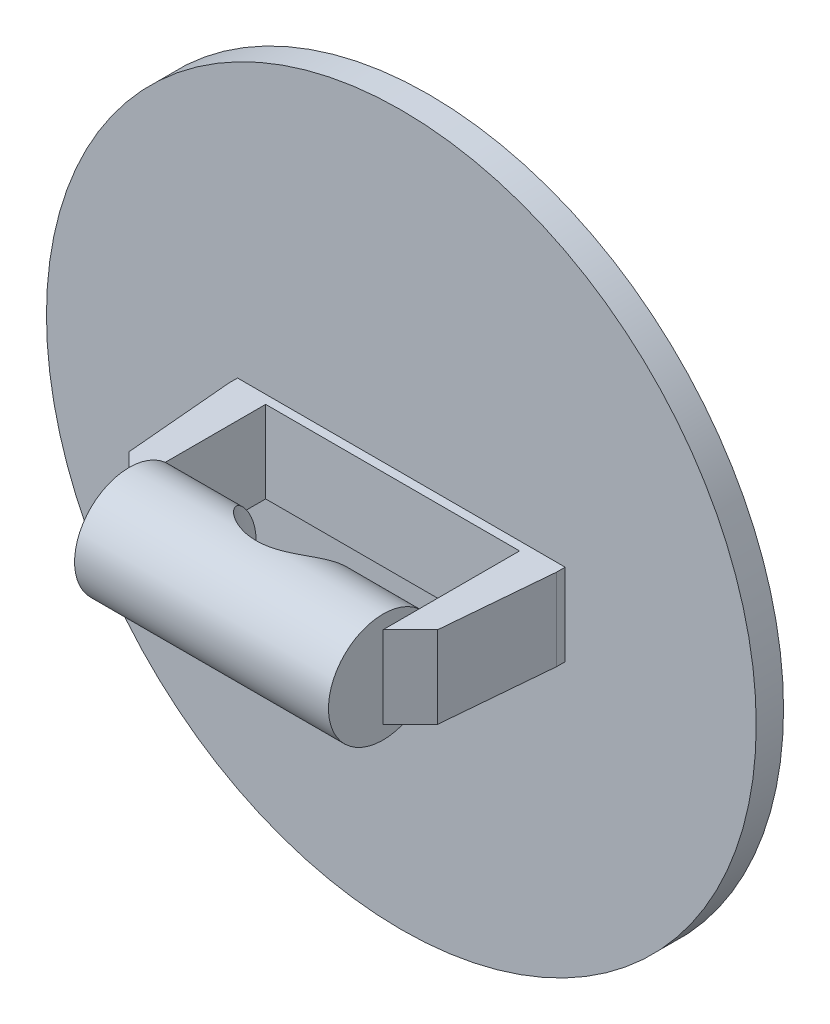
ISO-10303-21;
HEADER;
FILE_DESCRIPTION(('STEP AP214'),'2;1');
FILE_NAME('part.step','',(''),(''),'','','');
FILE_SCHEMA(('AUTOMOTIVE_DESIGN { 1 0 10303 214 1 1 1 1 }'));
ENDSEC;
DATA;
#1=APPLICATION_CONTEXT('core data for automotive mechanical design processes');
#2=APPLICATION_PROTOCOL_DEFINITION('international standard','automotive_design',2000,#1);
#3=PRODUCT_CONTEXT('',#1,'mechanical');
#4=PRODUCT('Part','Part','',(#3));
#5=PRODUCT_RELATED_PRODUCT_CATEGORY('part','',(#4));
#6=PRODUCT_DEFINITION_FORMATION('','',#4);
#7=PRODUCT_DEFINITION_CONTEXT('part definition',#1,'design');
#8=PRODUCT_DEFINITION('design','',#6,#7);
#9=PRODUCT_DEFINITION_SHAPE('','',#8);
#10=(LENGTH_UNIT() NAMED_UNIT(*) SI_UNIT(.MILLI.,.METRE.));
#11=(NAMED_UNIT(*) PLANE_ANGLE_UNIT() SI_UNIT($,.RADIAN.));
#12=(NAMED_UNIT(*) SI_UNIT($,.STERADIAN.) SOLID_ANGLE_UNIT());
#13=UNCERTAINTY_MEASURE_WITH_UNIT(LENGTH_MEASURE(1.E-05),#10,'distance_accuracy_value','');
#14=(GEOMETRIC_REPRESENTATION_CONTEXT(3) GLOBAL_UNCERTAINTY_ASSIGNED_CONTEXT((#13)) GLOBAL_UNIT_ASSIGNED_CONTEXT((#10,
#11,#12)) REPRESENTATION_CONTEXT('',''));
#15=CARTESIAN_POINT('',(0.,0.,0.));
#16=DIRECTION('',(0.,0.,1.));
#17=DIRECTION('',(1.,0.,0.));
#18=AXIS2_PLACEMENT_3D('',#15,#16,#17);
#19=CARTESIAN_POINT('',(0.,0.,0.254));
#20=DIRECTION('',(0.,0.,1.));
#21=DIRECTION('',(1.,0.,0.));
#22=AXIS2_PLACEMENT_3D('',#19,#20,#21);
#23=PLANE('',#22);
#24=DIRECTION('',(0.,-1.,0.));
#25=VECTOR('',#24,1.);
#26=CARTESIAN_POINT('',(3.6909734933052,1.190625,0.254));
#27=LINE('',#26,#25);
#28=CARTESIAN_POINT('',(3.6909734933052,1.190625,0.254));
#29=VERTEX_POINT('',#28);
#30=CARTESIAN_POINT('',(3.6909734933052,-1.190625,0.254));
#31=VERTEX_POINT('',#30);
#32=EDGE_CURVE('E185',#29,#31,#27,.T.);
#33=ORIENTED_EDGE('',*,*,#32,.F.);
#34=DIRECTION('',(-1.,0.,0.));
#35=VECTOR('',#34,1.);
#36=CARTESIAN_POINT('',(-4.7625,1.190625,0.254));
#37=LINE('',#36,#35);
#38=CARTESIAN_POINT('',(-3.6909734933052,1.190625,0.254));
#39=VERTEX_POINT('',#38);
#40=EDGE_CURVE('E165',#29,#39,#37,.T.);
#41=ORIENTED_EDGE('',*,*,#40,.T.);
#42=DIRECTION('',(0.,-1.,0.));
#43=VECTOR('',#42,1.);
#44=CARTESIAN_POINT('',(-3.6909734933052,1.190625,0.254));
#45=LINE('',#44,#43);
#46=CARTESIAN_POINT('',(-3.6909734933052,-1.190625,0.254));
#47=VERTEX_POINT('',#46);
#48=EDGE_CURVE('E206',#39,#47,#45,.T.);
#49=ORIENTED_EDGE('',*,*,#48,.T.);
#50=DIRECTION('',(1.,0.,0.));
#51=VECTOR('',#50,1.);
#52=CARTESIAN_POINT('',(-4.7625,-1.190625,0.254));
#53=LINE('',#52,#51);
#54=EDGE_CURVE('E231',#47,#31,#53,.T.);
#55=ORIENTED_EDGE('',*,*,#54,.T.);
#56=EDGE_LOOP('',(#33,#41,#49,#55));
#57=FACE_BOUND('',#56,.T.);
#58=ADVANCED_FACE('F38',(#57),#23,.T.);
#59=CARTESIAN_POINT('',(0.,0.,-0.79375));
#60=DIRECTION('',(0.,0.,1.));
#61=DIRECTION('',(1.,0.,0.));
#62=AXIS2_PLACEMENT_3D('',#59,#60,#61);
#63=CYLINDRICAL_SURFACE('',#62,10.31875);
#64=CARTESIAN_POINT('',(0.,0.,-0.79375));
#65=DIRECTION('',(0.,0.,1.));
#66=DIRECTION('',(1.,0.,0.));
#67=AXIS2_PLACEMENT_3D('',#64,#65,#66);
#68=CIRCLE('',#67,10.31875);
#69=CARTESIAN_POINT('',(10.31875,0.,-0.79375));
#70=VERTEX_POINT('',#69);
#71=EDGE_CURVE('E53',#70,#70,#68,.T.);
#72=ORIENTED_EDGE('',*,*,#71,.T.);
#73=EDGE_LOOP('',(#72));
#74=FACE_BOUND('',#73,.T.);
#75=CARTESIAN_POINT('',(0.,0.,0.));
#76=DIRECTION('',(0.,0.,1.));
#77=DIRECTION('',(1.,0.,0.));
#78=AXIS2_PLACEMENT_3D('',#75,#76,#77);
#79=CIRCLE('',#78,10.31875);
#80=CARTESIAN_POINT('',(10.31875,0.,0.));
#81=VERTEX_POINT('',#80);
#82=EDGE_CURVE('E11',#81,#81,#79,.T.);
#83=ORIENTED_EDGE('',*,*,#82,.F.);
#84=EDGE_LOOP('',(#83));
#85=FACE_BOUND('',#84,.T.);
#86=ADVANCED_FACE('F40',(#74,#85),#63,.T.);
#87=CARTESIAN_POINT('',(0.,0.,0.));
#88=DIRECTION('',(0.,0.,1.));
#89=DIRECTION('',(1.,0.,0.));
#90=AXIS2_PLACEMENT_3D('',#87,#88,#89);
#91=PLANE('',#90);
#92=DIRECTION('',(0.,-1.,0.));
#93=VECTOR('',#92,1.);
#94=CARTESIAN_POINT('',(-4.7625,1.190625,0.));
#95=LINE('',#94,#93);
#96=CARTESIAN_POINT('',(-4.7625,1.190625,0.));
#97=VERTEX_POINT('',#96);
#98=CARTESIAN_POINT('',(-4.7625,-1.190625,0.));
#99=VERTEX_POINT('',#98);
#100=EDGE_CURVE('E221',#97,#99,#95,.T.);
#101=ORIENTED_EDGE('',*,*,#100,.F.);
#102=DIRECTION('',(-1.,0.,0.));
#103=VECTOR('',#102,1.);
#104=CARTESIAN_POINT('',(-4.7625,1.190625,0.));
#105=LINE('',#104,#103);
#106=CARTESIAN_POINT('',(4.7625,1.190625,0.));
#107=VERTEX_POINT('',#106);
#108=EDGE_CURVE('E232',#107,#97,#105,.T.);
#109=ORIENTED_EDGE('',*,*,#108,.F.);
#110=DIRECTION('',(0.,1.,0.));
#111=VECTOR('',#110,1.);
#112=CARTESIAN_POINT('',(4.7625,1.190625,0.));
#113=LINE('',#112,#111);
#114=CARTESIAN_POINT('',(4.7625,-1.190625,0.));
#115=VERTEX_POINT('',#114);
#116=EDGE_CURVE('E249',#115,#107,#113,.T.);
#117=ORIENTED_EDGE('',*,*,#116,.F.);
#118=DIRECTION('',(1.,0.,0.));
#119=VECTOR('',#118,1.);
#120=CARTESIAN_POINT('',(-4.7625,-1.190625,0.));
#121=LINE('',#120,#119);
#122=EDGE_CURVE('E245',#99,#115,#121,.T.);
#123=ORIENTED_EDGE('',*,*,#122,.F.);
#124=EDGE_LOOP('',(#101,#109,#117,#123));
#125=FACE_BOUND('',#124,.T.);
#126=ORIENTED_EDGE('',*,*,#82,.T.);
#127=EDGE_LOOP('',(#126));
#128=FACE_BOUND('',#127,.T.);
#129=ADVANCED_FACE('F280',(#125,#128),#91,.T.);
#130=CARTESIAN_POINT('',(0.,0.,31.9484375));
#131=DIRECTION('',(0.,0.,1.));
#132=DIRECTION('',(0.,1.,0.));
#133=AXIS2_PLACEMENT_3D('',#130,#131,#132);
#134=SPHERICAL_SURFACE('',#133,34.3296875);
#135=ORIENTED_EDGE('',*,*,#71,.F.);
#136=EDGE_LOOP('',(#135));
#137=FACE_BOUND('',#136,.T.);
#138=ADVANCED_FACE('F277',(#137),#134,.T.);
#139=CARTESIAN_POINT('',(-4.7625,1.190625,0.254));
#140=DIRECTION('',(1.,0.,0.));
#141=DIRECTION('',(0.,0.,-1.));
#142=AXIS2_PLACEMENT_3D('',#139,#140,#141);
#143=PLANE('',#142);
#144=ORIENTED_EDGE('',*,*,#100,.T.);
#145=DIRECTION('',(0.,0.,-1.));
#146=VECTOR('',#145,1.);
#147=CARTESIAN_POINT('',(-4.7625,-1.190625,0.254));
#148=LINE('',#147,#146);
#149=CARTESIAN_POINT('',(-4.7625,-1.190625,0.254));
#150=VERTEX_POINT('',#149);
#151=EDGE_CURVE('E266',#150,#99,#148,.T.);
#152=ORIENTED_EDGE('',*,*,#151,.F.);
#153=DIRECTION('',(0.,-1.,0.));
#154=VECTOR('',#153,1.);
#155=CARTESIAN_POINT('',(-4.7625,1.190625,0.254));
#156=LINE('',#155,#154);
#157=CARTESIAN_POINT('',(-4.7625,1.190625,0.254));
#158=VERTEX_POINT('',#157);
#159=EDGE_CURVE('E228',#158,#150,#156,.T.);
#160=ORIENTED_EDGE('',*,*,#159,.F.);
#161=DIRECTION('',(0.,0.,-1.));
#162=VECTOR('',#161,1.);
#163=CARTESIAN_POINT('',(-4.7625,1.190625,0.254));
#164=LINE('',#163,#162);
#165=EDGE_CURVE('E241',#158,#97,#164,.T.);
#166=ORIENTED_EDGE('',*,*,#165,.T.);
#167=EDGE_LOOP('',(#144,#152,#160,#166));
#168=FACE_BOUND('',#167,.T.);
#169=ADVANCED_FACE('F279',(#168),#143,.F.);
#170=CARTESIAN_POINT('',(-4.7625,-1.190625,0.254));
#171=DIRECTION('',(0.,1.,0.));
#172=DIRECTION('',(0.,0.,1.));
#173=AXIS2_PLACEMENT_3D('',#170,#171,#172);
#174=PLANE('',#173);
#175=ORIENTED_EDGE('',*,*,#122,.T.);
#176=DIRECTION('',(0.,0.,-1.));
#177=VECTOR('',#176,1.);
#178=CARTESIAN_POINT('',(4.7625,-1.190625,0.254));
#179=LINE('',#178,#177);
#180=CARTESIAN_POINT('',(4.7625,-1.190625,0.254));
#181=VERTEX_POINT('',#180);
#182=EDGE_CURVE('E262',#181,#115,#179,.T.);
#183=ORIENTED_EDGE('',*,*,#182,.F.);
#184=DIRECTION('',(-0.0871557427476582,0.,0.996194698091745));
#185=VECTOR('',#184,1.);
#186=CARTESIAN_POINT('',(4.48472349330519,-1.190625,3.429));
#187=LINE('',#186,#185);
#188=CARTESIAN_POINT('',(4.48472349330519,-1.190625,3.429));
#189=VERTEX_POINT('',#188);
#190=EDGE_CURVE('E161',#181,#189,#187,.T.);
#191=ORIENTED_EDGE('',*,*,#190,.T.);
#192=DIRECTION('',(-0.707106781186543,0.,0.707106781186551));
#193=VECTOR('',#192,1.);
#194=CARTESIAN_POINT('',(3.6909734933052,-1.190625,4.22275));
#195=LINE('',#194,#193);
#196=CARTESIAN_POINT('',(3.6909734933052,-1.190625,4.22275));
#197=VERTEX_POINT('',#196);
#198=EDGE_CURVE('E178',#189,#197,#195,.T.);
#199=ORIENTED_EDGE('',*,*,#198,.T.);
#200=DIRECTION('',(0.,0.,-1.));
#201=VECTOR('',#200,1.);
#202=CARTESIAN_POINT('',(3.6909734933052,-1.190625,0.254));
#203=LINE('',#202,#201);
#204=CARTESIAN_POINT('',(3.6909734933052,-1.190625,3.17271744842124));
#205=VERTEX_POINT('',#204);
#206=EDGE_CURVE('E182',#197,#205,#203,.T.);
#207=ORIENTED_EDGE('',*,*,#206,.T.);
#208=EDGE_CURVE('E67',#205,#31,#203,.T.);
#209=ORIENTED_EDGE('',*,*,#208,.T.);
#210=ORIENTED_EDGE('',*,*,#54,.F.);
#211=DIRECTION('',(0.,0.,1.));
#212=VECTOR('',#211,1.);
#213=CARTESIAN_POINT('',(-3.6909734933052,-1.190625,0.254));
#214=LINE('',#213,#212);
#215=CARTESIAN_POINT('',(-3.6909734933052,-1.190625,3.17271744842124));
#216=VERTEX_POINT('',#215);
#217=EDGE_CURVE('E211',#47,#216,#214,.T.);
#218=ORIENTED_EDGE('',*,*,#217,.T.);
#219=CARTESIAN_POINT('',(-3.6909734933052,-1.190625,4.22275));
#220=VERTEX_POINT('',#219);
#221=EDGE_CURVE('E210',#216,#220,#214,.T.);
#222=ORIENTED_EDGE('',*,*,#221,.T.);
#223=DIRECTION('',(-0.707106781186543,0.,-0.707106781186551));
#224=VECTOR('',#223,1.);
#225=CARTESIAN_POINT('',(-3.6909734933052,-1.190625,4.22275));
#226=LINE('',#225,#224);
#227=CARTESIAN_POINT('',(-4.48472349330519,-1.190625,3.429));
#228=VERTEX_POINT('',#227);
#229=EDGE_CURVE('E197',#220,#228,#226,.T.);
#230=ORIENTED_EDGE('',*,*,#229,.T.);
#231=DIRECTION('',(-0.0871557427476582,0.,-0.996194698091745));
#232=VECTOR('',#231,1.);
#233=CARTESIAN_POINT('',(-4.48472349330519,-1.190625,3.429));
#234=LINE('',#233,#232);
#235=EDGE_CURVE('E188',#228,#150,#234,.T.);
#236=ORIENTED_EDGE('',*,*,#235,.T.);
#237=ORIENTED_EDGE('',*,*,#151,.T.);
#238=EDGE_LOOP('',(#175,#183,#191,#199,#207,#209,#210,#218,#222,#230,#236,#237));
#239=FACE_BOUND('',#238,.T.);
#240=ADVANCED_FACE('F286',(#239),#174,.F.);
#241=CARTESIAN_POINT('',(4.7625,1.190625,0.254));
#242=DIRECTION('',(-1.,0.,0.));
#243=DIRECTION('',(0.,0.,1.));
#244=AXIS2_PLACEMENT_3D('',#241,#242,#243);
#245=PLANE('',#244);
#246=ORIENTED_EDGE('',*,*,#116,.T.);
#247=DIRECTION('',(0.,0.,-1.));
#248=VECTOR('',#247,1.);
#249=CARTESIAN_POINT('',(4.7625,1.190625,0.254));
#250=LINE('',#249,#248);
#251=CARTESIAN_POINT('',(4.7625,1.190625,0.254));
#252=VERTEX_POINT('',#251);
#253=EDGE_CURVE('E258',#252,#107,#250,.T.);
#254=ORIENTED_EDGE('',*,*,#253,.F.);
#255=DIRECTION('',(0.,1.,0.));
#256=VECTOR('',#255,1.);
#257=CARTESIAN_POINT('',(4.7625,1.190625,0.254));
#258=LINE('',#257,#256);
#259=EDGE_CURVE('E235',#181,#252,#258,.T.);
#260=ORIENTED_EDGE('',*,*,#259,.F.);
#261=ORIENTED_EDGE('',*,*,#182,.T.);
#262=EDGE_LOOP('',(#246,#254,#260,#261));
#263=FACE_BOUND('',#262,.T.);
#264=ADVANCED_FACE('F302',(#263),#245,.F.);
#265=CARTESIAN_POINT('',(-4.7625,1.190625,0.254));
#266=DIRECTION('',(0.,-1.,0.));
#267=DIRECTION('',(0.,0.,-1.));
#268=AXIS2_PLACEMENT_3D('',#265,#266,#267);
#269=PLANE('',#268);
#270=ORIENTED_EDGE('',*,*,#108,.T.);
#271=ORIENTED_EDGE('',*,*,#165,.F.);
#272=DIRECTION('',(-0.0871557427476582,0.,-0.996194698091745));
#273=VECTOR('',#272,1.);
#274=CARTESIAN_POINT('',(-4.48472349330519,1.190625,3.429));
#275=LINE('',#274,#273);
#276=CARTESIAN_POINT('',(-4.48472349330519,1.190625,3.429));
#277=VERTEX_POINT('',#276);
#278=EDGE_CURVE('E193',#277,#158,#275,.T.);
#279=ORIENTED_EDGE('',*,*,#278,.F.);
#280=DIRECTION('',(-0.707106781186543,0.,-0.707106781186551));
#281=VECTOR('',#280,1.);
#282=CARTESIAN_POINT('',(-3.6909734933052,1.190625,4.22275));
#283=LINE('',#282,#281);
#284=CARTESIAN_POINT('',(-3.6909734933052,1.190625,4.22275));
#285=VERTEX_POINT('',#284);
#286=EDGE_CURVE('E202',#285,#277,#283,.T.);
#287=ORIENTED_EDGE('',*,*,#286,.F.);
#288=DIRECTION('',(0.,0.,1.));
#289=VECTOR('',#288,1.);
#290=CARTESIAN_POINT('',(-3.6909734933052,1.190625,0.254));
#291=LINE('',#290,#289);
#292=CARTESIAN_POINT('',(-3.6909734933052,1.190625,3.17271744842124));
#293=VERTEX_POINT('',#292);
#294=EDGE_CURVE('E196',#293,#285,#291,.T.);
#295=ORIENTED_EDGE('',*,*,#294,.F.);
#296=EDGE_CURVE('E198',#39,#293,#291,.T.);
#297=ORIENTED_EDGE('',*,*,#296,.F.);
#298=ORIENTED_EDGE('',*,*,#40,.F.);
#299=DIRECTION('',(0.,0.,-1.));
#300=VECTOR('',#299,1.);
#301=CARTESIAN_POINT('',(3.6909734933052,1.190625,0.254));
#302=LINE('',#301,#300);
#303=CARTESIAN_POINT('',(3.6909734933052,1.190625,3.17271744842124));
#304=VERTEX_POINT('',#303);
#305=EDGE_CURVE('E148',#304,#29,#302,.T.);
#306=ORIENTED_EDGE('',*,*,#305,.F.);
#307=CARTESIAN_POINT('',(3.6909734933052,1.190625,4.22275));
#308=VERTEX_POINT('',#307);
#309=EDGE_CURVE('E135',#308,#304,#302,.T.);
#310=ORIENTED_EDGE('',*,*,#309,.F.);
#311=DIRECTION('',(-0.707106781186543,0.,0.707106781186551));
#312=VECTOR('',#311,1.);
#313=CARTESIAN_POINT('',(3.6909734933052,1.190625,4.22275));
#314=LINE('',#313,#312);
#315=CARTESIAN_POINT('',(4.48472349330519,1.190625,3.429));
#316=VERTEX_POINT('',#315);
#317=EDGE_CURVE('E168',#316,#308,#314,.T.);
#318=ORIENTED_EDGE('',*,*,#317,.F.);
#319=DIRECTION('',(-0.0871557427476582,0.,0.996194698091745));
#320=VECTOR('',#319,1.);
#321=CARTESIAN_POINT('',(4.48472349330519,1.190625,3.429));
#322=LINE('',#321,#320);
#323=EDGE_CURVE('E171',#252,#316,#322,.T.);
#324=ORIENTED_EDGE('',*,*,#323,.F.);
#325=ORIENTED_EDGE('',*,*,#253,.T.);
#326=EDGE_LOOP('',(#270,#271,#279,#287,#295,#297,#298,#306,#310,#318,#324,#325));
#327=FACE_BOUND('',#326,.T.);
#328=ADVANCED_FACE('F163',(#327),#269,.F.);
#329=CARTESIAN_POINT('',(-4.48472349330519,1.190625,3.429));
#330=DIRECTION('',(-0.996194698091746,0.,0.0871557427476582));
#331=DIRECTION('',(0.0871557427476582,0.,0.996194698091746));
#332=AXIS2_PLACEMENT_3D('',#329,#330,#331);
#333=PLANE('',#332);
#334=ORIENTED_EDGE('',*,*,#235,.F.);
#335=DIRECTION('',(0.,-1.,0.));
#336=VECTOR('',#335,1.);
#337=CARTESIAN_POINT('',(-4.48472349330519,1.190625,3.429));
#338=LINE('',#337,#336);
#339=EDGE_CURVE('E218',#277,#228,#338,.T.);
#340=ORIENTED_EDGE('',*,*,#339,.F.);
#341=ORIENTED_EDGE('',*,*,#278,.T.);
#342=ORIENTED_EDGE('',*,*,#159,.T.);
#343=EDGE_LOOP('',(#334,#340,#341,#342));
#344=FACE_BOUND('',#343,.T.);
#345=ADVANCED_FACE('F298',(#344),#333,.T.);
#346=CARTESIAN_POINT('',(-3.6909734933052,1.190625,4.22275));
#347=DIRECTION('',(-0.707106781186552,0.,0.707106781186544));
#348=DIRECTION('',(0.707106781186544,0.,0.707106781186552));
#349=AXIS2_PLACEMENT_3D('',#346,#347,#348);
#350=PLANE('',#349);
#351=ORIENTED_EDGE('',*,*,#229,.F.);
#352=DIRECTION('',(0.,-1.,0.));
#353=VECTOR('',#352,1.);
#354=CARTESIAN_POINT('',(-3.6909734933052,1.190625,4.22275));
#355=LINE('',#354,#353);
#356=EDGE_CURVE('E222',#285,#220,#355,.T.);
#357=ORIENTED_EDGE('',*,*,#356,.F.);
#358=ORIENTED_EDGE('',*,*,#286,.T.);
#359=ORIENTED_EDGE('',*,*,#339,.T.);
#360=EDGE_LOOP('',(#351,#357,#358,#359));
#361=FACE_BOUND('',#360,.T.);
#362=ADVANCED_FACE('F355',(#361),#350,.T.);
#363=CARTESIAN_POINT('',(-3.6909734933052,1.190625,0.254));
#364=DIRECTION('',(1.,0.,0.));
#365=DIRECTION('',(0.,0.,-1.));
#366=AXIS2_PLACEMENT_3D('',#363,#364,#365);
#367=PLANE('',#366);
#368=ORIENTED_EDGE('',*,*,#296,.T.);
#369=CARTESIAN_POINT('',(-3.6909734933052,0.,4.22275));
#370=DIRECTION('',(1.,0.,0.));
#371=DIRECTION('',(0.,0.,-1.));
#372=AXIS2_PLACEMENT_3D('',#369,#370,#371);
#373=CIRCLE('',#372,1.5875);
#374=EDGE_CURVE('E323',#216,#293,#373,.T.);
#375=ORIENTED_EDGE('',*,*,#374,.F.);
#376=ORIENTED_EDGE('',*,*,#217,.F.);
#377=ORIENTED_EDGE('',*,*,#48,.F.);
#378=EDGE_LOOP('',(#368,#375,#376,#377));
#379=FACE_BOUND('',#378,.T.);
#380=ADVANCED_FACE('F354',(#379),#367,.T.);
#381=CARTESIAN_POINT('',(4.48472349330519,1.190625,3.429));
#382=DIRECTION('',(0.996194698091746,0.,0.0871557427476582));
#383=DIRECTION('',(0.0871557427476582,0.,-0.996194698091746));
#384=AXIS2_PLACEMENT_3D('',#381,#382,#383);
#385=PLANE('',#384);
#386=ORIENTED_EDGE('',*,*,#190,.F.);
#387=ORIENTED_EDGE('',*,*,#259,.T.);
#388=ORIENTED_EDGE('',*,*,#323,.T.);
#389=DIRECTION('',(0.,-1.,0.));
#390=VECTOR('',#389,1.);
#391=CARTESIAN_POINT('',(4.48472349330519,1.190625,3.429));
#392=LINE('',#391,#390);
#393=EDGE_CURVE('E147',#316,#189,#392,.T.);
#394=ORIENTED_EDGE('',*,*,#393,.T.);
#395=EDGE_LOOP('',(#386,#387,#388,#394));
#396=FACE_BOUND('',#395,.T.);
#397=ADVANCED_FACE('F315',(#396),#385,.T.);
#398=CARTESIAN_POINT('',(3.6909734933052,1.190625,0.254));
#399=DIRECTION('',(-1.,0.,0.));
#400=DIRECTION('',(0.,0.,1.));
#401=AXIS2_PLACEMENT_3D('',#398,#399,#400);
#402=PLANE('',#401);
#403=ORIENTED_EDGE('',*,*,#208,.F.);
#404=CARTESIAN_POINT('',(3.6909734933052,0.,4.22275));
#405=DIRECTION('',(-1.,0.,0.));
#406=DIRECTION('',(0.,0.,1.));
#407=AXIS2_PLACEMENT_3D('',#404,#405,#406);
#408=CIRCLE('',#407,1.5875);
#409=EDGE_CURVE('E153',#304,#205,#408,.T.);
#410=ORIENTED_EDGE('',*,*,#409,.F.);
#411=ORIENTED_EDGE('',*,*,#305,.T.);
#412=ORIENTED_EDGE('',*,*,#32,.T.);
#413=EDGE_LOOP('',(#403,#410,#411,#412));
#414=FACE_BOUND('',#413,.T.);
#415=ADVANCED_FACE('F157',(#414),#402,.T.);
#416=CARTESIAN_POINT('',(3.6909734933052,1.190625,4.22275));
#417=DIRECTION('',(0.707106781186552,0.,0.707106781186544));
#418=DIRECTION('',(0.707106781186544,0.,-0.707106781186552));
#419=AXIS2_PLACEMENT_3D('',#416,#417,#418);
#420=PLANE('',#419);
#421=ORIENTED_EDGE('',*,*,#198,.F.);
#422=ORIENTED_EDGE('',*,*,#393,.F.);
#423=ORIENTED_EDGE('',*,*,#317,.T.);
#424=DIRECTION('',(0.,-1.,0.));
#425=VECTOR('',#424,1.);
#426=CARTESIAN_POINT('',(3.6909734933052,1.190625,4.22275));
#427=LINE('',#426,#425);
#428=EDGE_CURVE('E141',#308,#197,#427,.T.);
#429=ORIENTED_EDGE('',*,*,#428,.T.);
#430=EDGE_LOOP('',(#421,#422,#423,#429));
#431=FACE_BOUND('',#430,.T.);
#432=ADVANCED_FACE('F318',(#431),#420,.T.);
#433=CARTESIAN_POINT('',(-3.6909734933052,0.,4.22275));
#434=DIRECTION('',(1.,0.,0.));
#435=DIRECTION('',(0.,0.,-1.));
#436=AXIS2_PLACEMENT_3D('',#433,#434,#435);
#437=PLANE('',#436);
#438=ORIENTED_EDGE('',*,*,#356,.T.);
#439=ORIENTED_EDGE('',*,*,#221,.F.);
#440=EDGE_CURVE('E59',#293,#216,#373,.T.);
#441=ORIENTED_EDGE('',*,*,#440,.F.);
#442=ORIENTED_EDGE('',*,*,#294,.T.);
#443=EDGE_LOOP('',(#438,#439,#441,#442));
#444=FACE_BOUND('',#443,.T.);
#445=ADVANCED_FACE('F343',(#444),#437,.F.);
#446=CARTESIAN_POINT('',(3.6909734933052,1.190625,0.254));
#447=DIRECTION('',(-1.,0.,0.));
#448=DIRECTION('',(0.,0.,1.));
#449=AXIS2_PLACEMENT_3D('',#446,#447,#448);
#450=PLANE('',#449);
#451=EDGE_CURVE('E138',#205,#304,#408,.T.);
#452=ORIENTED_EDGE('',*,*,#451,.F.);
#453=ORIENTED_EDGE('',*,*,#206,.F.);
#454=ORIENTED_EDGE('',*,*,#428,.F.);
#455=ORIENTED_EDGE('',*,*,#309,.T.);
#456=EDGE_LOOP('',(#452,#453,#454,#455));
#457=FACE_BOUND('',#456,.T.);
#458=ADVANCED_FACE('F137',(#457),#450,.F.);
#459=CARTESIAN_POINT('',(8.18110155383977,0.,4.22275));
#460=DIRECTION('',(-1.,0.,0.));
#461=DIRECTION('',(0.,0.,1.));
#462=AXIS2_PLACEMENT_3D('',#459,#460,#461);
#463=CYLINDRICAL_SURFACE('',#462,1.5875);
#464=CARTESIAN_POINT('',(1.5875,0.,2.63525));
#465=CARTESIAN_POINT('',(1.58750426187375,0.0884073441701925,2.63525271107212));
#466=CARTESIAN_POINT('',(1.58755296050247,0.176844846491641,2.6426558487905));
#467=CARTESIAN_POINT('',(1.58713884789841,0.351310420747491,2.67208114107496));
#468=CARTESIAN_POINT('',(1.58667563238523,0.437336533254671,2.69411484453291));
#469=CARTESIAN_POINT('',(1.58345153436839,0.604607730185795,2.75222241294522));
#470=CARTESIAN_POINT('',(1.58068777294791,0.6858466874678,2.78831383969273));
#471=CARTESIAN_POINT('',(1.57011961878488,0.84094244172311,2.87338660499733));
#472=CARTESIAN_POINT('',(1.56231706896294,0.914801926314633,2.92236322695628));
#473=CARTESIAN_POINT('',(1.53881617466736,1.04989225282065,3.02902086827161));
#474=CARTESIAN_POINT('',(1.52343973318144,1.11150496191571,3.08628482870076));
#475=CARTESIAN_POINT('',(1.4820857661653,1.22332697472952,3.20766110245898));
#476=CARTESIAN_POINT('',(1.45612569118724,1.27355483894578,3.27176201500255));
#477=CARTESIAN_POINT('',(1.39616380469312,1.35536854353722,3.39343043350804));
#478=CARTESIAN_POINT('',(1.3637370828003,1.38856109829654,3.45069996539392));
#479=CARTESIAN_POINT('',(1.28943692414266,1.44563443966917,3.56373027647179));
#480=CARTESIAN_POINT('',(1.24756323247006,1.46951497496861,3.6194910149065));
#481=CARTESIAN_POINT('',(1.15782254720834,1.50787719545586,3.72338924788887));
#482=CARTESIAN_POINT('',(1.11044316013348,1.52282314918929,3.7717812186677));
#483=CARTESIAN_POINT('',(1.0090494240733,1.54684505814792,3.86269344037614));
#484=CARTESIAN_POINT('',(0.95503291049811,1.55591909226448,3.90521176605778));
#485=CARTESIAN_POINT('',(0.835956938336294,1.57049107805515,3.9869340313293));
#486=CARTESIAN_POINT('',(0.770333649425275,1.57554614593053,4.02539330577406));
#487=CARTESIAN_POINT('',(0.634124237368494,1.58251551174679,4.09258330593564));
#488=CARTESIAN_POINT('',(0.56353544286551,1.58442810540445,4.12130874592553));
#489=CARTESIAN_POINT('',(0.409888946674364,1.58689037722721,4.17130293442636));
#490=CARTESIAN_POINT('',(0.32637561172426,1.58723979593563,4.19119067607624));
#491=CARTESIAN_POINT('',(0.15723644553786,1.58754405086438,4.21726158293385));
#492=CARTESIAN_POINT('',(0.0716102555855164,1.58749881961581,4.22344240459597));
#493=CARTESIAN_POINT('',(-0.103073939193076,1.58750122676506,4.22190361684421));
#494=CARTESIAN_POINT('',(-0.192127455479129,1.58755278235568,4.21359870191734));
#495=CARTESIAN_POINT('',(-0.3676123712138,1.58705774365978,4.18217189893449));
#496=CARTESIAN_POINT('',(-0.454042760076959,1.58651092177492,4.15904437435028));
#497=CARTESIAN_POINT('',(-0.621853078611659,1.58292717927202,4.09860696888733));
#498=CARTESIAN_POINT('',(-0.703228232195122,1.57988794123,4.06128390646208));
#499=CARTESIAN_POINT('',(-0.858299993341261,1.56845832637677,3.97367890079463));
#500=CARTESIAN_POINT('',(-0.931999645529656,1.56007008082297,3.92340212358051));
#501=CARTESIAN_POINT('',(-1.0656876114162,1.53516181038842,3.81486824904084));
#502=CARTESIAN_POINT('',(-1.12617716013116,1.51906922800915,3.75713568989808));
#503=CARTESIAN_POINT('',(-1.23569801945106,1.4761706801171,3.63519623495525));
#504=CARTESIAN_POINT('',(-1.28474800613364,1.44938237302438,3.57100014031534));
#505=CARTESIAN_POINT('',(-1.3643675567182,1.38794760101277,3.4496197613655));
#506=CARTESIAN_POINT('',(-1.39655034467797,1.3548866284112,3.39268403288598));
#507=CARTESIAN_POINT('',(-1.45176666567253,1.27945666677785,3.2805686925783));
#508=CARTESIAN_POINT('',(-1.474799480983,1.23708694797221,3.22538921882303));
#509=CARTESIAN_POINT('',(-1.5118484743697,1.14624553068284,3.12240646600751));
#510=CARTESIAN_POINT('',(-1.52626557893256,1.0981967805702,3.07437026532791));
#511=CARTESIAN_POINT('',(-1.5493456434367,0.99554493329577,2.98431791993502));
#512=CARTESIAN_POINT('',(-1.55800669446738,0.940939668843499,2.94230377596781));
#513=CARTESIAN_POINT('',(-1.57187180718104,0.820469561785744,2.86158437022275));
#514=CARTESIAN_POINT('',(-1.5766260148315,0.754024293096522,2.82366998914029));
#515=CARTESIAN_POINT('',(-1.58311389905949,0.616248351964253,2.75774588357734));
#516=CARTESIAN_POINT('',(-1.58484594540653,0.544915064346514,2.72974151129564));
#517=CARTESIAN_POINT('',(-1.58703467494188,0.389958133785821,2.68150011636254));
#518=CARTESIAN_POINT('',(-1.58730871931724,0.305900638616333,2.66263840971895));
#519=CARTESIAN_POINT('',(-1.58754110490691,0.135842976918044,2.63874206651595));
#520=CARTESIAN_POINT('',(-1.58749939548229,0.0498425009892631,2.63370964800158));
#521=CARTESIAN_POINT('',(-1.58750052047255,-0.125125289608065,2.63768135283573));
#522=CARTESIAN_POINT('',(-1.58754663464877,-0.214080879515051,2.64722726042919));
#523=CARTESIAN_POINT('',(-1.58692657852946,-0.389163549496291,2.68110717436235));
#524=CARTESIAN_POINT('',(-1.58626012751579,-0.475289501040076,2.70544700720211));
#525=CARTESIAN_POINT('',(-1.58223270373332,-0.642231554845648,2.7682233057109));
#526=CARTESIAN_POINT('',(-1.57887084406455,-0.723045899899587,2.80666440901723));
#527=CARTESIAN_POINT('',(-1.56653031999352,-0.876781384631831,2.89635903220936));
#528=CARTESIAN_POINT('',(-1.55755439390861,-0.949706352104647,2.94760629844723));
#529=CARTESIAN_POINT('',(-1.53128431270341,-1.08138780909311,3.05754436024803));
#530=CARTESIAN_POINT('',(-1.51446824136151,-1.14069858707614,3.11567995618785));
#531=CARTESIAN_POINT('',(-1.47003498473697,-1.24783266706493,3.23804005469805));
#532=CARTESIAN_POINT('',(-1.44243514142952,-1.29567421503949,3.30225465628023));
#533=CARTESIAN_POINT('',(-1.37956253913133,-1.37310204337669,3.42325559761785));
#534=CARTESIAN_POINT('',(-1.34587417179995,-1.40429642910099,3.47984418992293));
#535=CARTESIAN_POINT('',(-1.26932964865553,-1.45769916276561,3.59102632087761));
#536=CARTESIAN_POINT('',(-1.22647240156083,-1.47990644014818,3.64561962114083));
#537=CARTESIAN_POINT('',(-1.13453018611979,-1.51567621494427,3.74768528945805));
#538=CARTESIAN_POINT('',(-1.08580417895462,-1.5295774054399,3.79536573979004));
#539=CARTESIAN_POINT('',(-0.981876014342196,-1.55174021380693,3.88455817929758));
#540=CARTESIAN_POINT('',(-0.926671669953475,-1.5599999207853,3.92606807465105));
#541=CARTESIAN_POINT('',(-0.804794507062441,-1.57317604000326,4.00576708651502));
#542=CARTESIAN_POINT('',(-0.737526768797749,-1.57763777664429,4.04311995070098));
#543=CARTESIAN_POINT('',(-0.598185773120838,-1.5836617434045,4.10774409142824));
#544=CARTESIAN_POINT('',(-0.526109968470586,-1.58522242374765,4.13500997316745));
#545=CARTESIAN_POINT('',(-0.369868746324904,-1.58715605227416,4.18145971442346));
#546=CARTESIAN_POINT('',(-0.285291902610827,-1.58736356967001,4.19927708419744));
#547=CARTESIAN_POINT('',(-0.11436917350485,-1.58753599033829,4.22096830641517));
#548=CARTESIAN_POINT('',(-0.0280230216661577,-1.58750085679728,4.22484004298106));
#549=CARTESIAN_POINT('',(0.147176847037892,-1.58749838965937,4.21842471504356));
#550=CARTESIAN_POINT('',(0.236012765599502,-1.58753346790226,4.20763821158409));
#551=CARTESIAN_POINT('',(0.410649837282117,-1.58676896061361,4.17131035320934));
#552=CARTESIAN_POINT('',(0.496449743429122,-1.58596903614481,4.1457630085778));
#553=CARTESIAN_POINT('',(0.662478368749024,-1.5814640701376,4.08066504078294));
#554=CARTESIAN_POINT('',(0.74270876224232,-1.5777599058318,4.04111864804376));
#555=CARTESIAN_POINT('',(0.895062289010937,-1.56446676835766,3.94936866882787));
#556=CARTESIAN_POINT('',(0.967190097924697,-1.55488120993098,3.89717243748795));
#557=CARTESIAN_POINT('',(1.09682448722905,-1.52721863890351,3.78589796421588));
#558=CARTESIAN_POINT('',(1.15494092508699,-1.50967329333745,3.72740380513549));
#559=CARTESIAN_POINT('',(1.25967152453132,-1.46370983715032,3.6047149243937));
#560=CARTESIAN_POINT('',(1.30630332931909,-1.43530857736114,3.5405291553955));
#561=CARTESIAN_POINT('',(1.3815685088082,-1.37101972941613,3.4199632367684));
#562=CARTESIAN_POINT('',(1.4117986090739,-1.33670911795379,3.36373020048012));
#563=CARTESIAN_POINT('',(1.46343480585373,-1.25906078390704,3.25349093257772));
#564=CARTESIAN_POINT('',(1.48483973035908,-1.21572186348682,3.19948499758562));
#565=CARTESIAN_POINT('',(1.51936342270437,-1.12267778545521,3.09833758944368));
#566=CARTESIAN_POINT('',(1.53276063460791,-1.07326916818573,3.05101557045138));
#567=CARTESIAN_POINT('',(1.55403055904563,-0.968046618318597,2.96268368428514));
#568=CARTESIAN_POINT('',(1.56190081793789,-0.912229853657744,2.92167662688138));
#569=CARTESIAN_POINT('',(1.57440705547699,-0.788918106390267,2.84300629217165));
#570=CARTESIAN_POINT('',(1.57858468545231,-0.720814912207962,2.80622535948692));
#571=CARTESIAN_POINT('',(1.58416263980036,-0.579904303857428,2.74293997029678));
#572=CARTESIAN_POINT('',(1.58556271182102,-0.507096462874002,2.71643644771042));
#573=CARTESIAN_POINT('',(1.58711588350771,-0.3624675024035,2.67545890370712));
#574=CARTESIAN_POINT('',(1.58733300027521,-0.290810236800281,2.6604061957511));
#575=CARTESIAN_POINT('',(1.58752330709817,-0.146108920332833,2.6403002258719));
#576=CARTESIAN_POINT('',(1.58749647774986,-0.0730647596144468,2.6352477594188));
#577=CARTESIAN_POINT('',(1.5875,0.,2.63525));
#578=B_SPLINE_CURVE_WITH_KNOTS('',3,(#464,#465,#466,#467,#468,#469,#470,#471,#472,#473,#474,
#475,#476,#477,#478,#479,#480,#481,#482,#483,#484,#485,#486,#487,#488,#489,#490,#491,#492,#493,
#494,#495,#496,#497,#498,#499,#500,#501,#502,#503,#504,#505,#506,#507,#508,#509,#510,#511,#512,
#513,#514,#515,#516,#517,#518,#519,#520,#521,#522,#523,#524,#525,#526,#527,#528,#529,#530,#531,
#532,#533,#534,#535,#536,#537,#538,#539,#540,#541,#542,#543,#544,#545,#546,#547,#548,#549,#550,
#551,#552,#553,#554,#555,#556,#557,#558,#559,#560,#561,#562,#563,#564,#565,#566,#567,#568,#569,
#570,#571,#572,#573,#574,#575,#576,#577),.UNSPECIFIED.,.T.,.F.,(4,2,2,2,2,2,2,2,2,2,2,2,2,2,2,2,
2,2,2,2,2,2,2,2,2,2,2,2,2,2,2,2,2,2,2,2,2,2,2,2,2,2,2,2,2,2,2,2,2,2,2,2,2,2,2,2,4),(0.,
0.264967533384915,0.530144472546329,0.795653755470753,1.06106598418822,1.31606163354392,
1.57063852941657,1.79057180066935,2.01051100709577,2.21771134100701,2.42497943016643,
2.65276385922022,2.88067178370109,3.13706952877685,3.39351110817133,3.66055573866431,
3.92770197733713,4.19509688794747,4.46238532429951,4.71631282735935,4.9698228235043,
5.18849968982991,5.40719370579494,5.61470195741154,5.82227899179744,6.05131162743793,
6.28046777094336,6.53775151973971,6.79507653122715,7.06220003818103,7.32942881838222,
7.59674556391253,7.86393202458498,8.11661202827343,8.36888734488629,8.58635002272036,
8.80383859741341,9.01171486609048,9.21966151210361,9.44995511740855,9.68037171276108,
9.93850157304097,10.1966705959926,10.4638601128959,10.7311581273079,10.9983754348039,
11.265437742357,11.5168182214087,11.7678100754026,11.9841161049344,12.2004508512849,
12.4087437612277,12.6171290826094,12.8487444136045,13.080380786799,13.2993473163595,
13.5183312629322),.UNSPECIFIED.);
#579=CARTESIAN_POINT('',(1.5875,0.,2.63525));
#580=VERTEX_POINT('',#579);
#581=EDGE_CURVE('E42',#580,#580,#578,.T.);
#582=ORIENTED_EDGE('',*,*,#581,.T.);
#583=EDGE_LOOP('',(#582));
#584=FACE_BOUND('',#583,.T.);
#585=ORIENTED_EDGE('',*,*,#409,.T.);
#586=ORIENTED_EDGE('',*,*,#451,.T.);
#587=EDGE_LOOP('',(#585,#586));
#588=FACE_BOUND('',#587,.T.);
#589=ORIENTED_EDGE('',*,*,#440,.T.);
#590=ORIENTED_EDGE('',*,*,#374,.T.);
#591=EDGE_LOOP('',(#589,#590));
#592=FACE_BOUND('',#591,.T.);
#593=ADVANCED_FACE('F152',(#584,#588,#592),#463,.T.);
#594=CARTESIAN_POINT('',(0.,10.31875,2.63525));
#595=DIRECTION('',(0.,-1.,0.));
#596=DIRECTION('',(0.,0.,-1.));
#597=AXIS2_PLACEMENT_3D('',#594,#595,#596);
#598=CYLINDRICAL_SURFACE('',#597,1.5875);
#599=ORIENTED_EDGE('',*,*,#581,.F.);
#600=EDGE_LOOP('',(#599));
#601=FACE_BOUND('',#600,.T.);
#602=ADVANCED_FACE('F334',(#601),#598,.F.);
#603=CLOSED_SHELL('',(#58,#86,#129,#138,#169,#240,#264,#328,#345,#362,#380,#397,#415,#432,#445,
#458,#593,#602));
#604=MANIFOLD_SOLID_BREP('B2',#603);
#605=ADVANCED_BREP_SHAPE_REPRESENTATION('',(#18,#604),#14);
#606=SHAPE_DEFINITION_REPRESENTATION(#9,#605);
ENDSEC;
END-ISO-10303-21;
